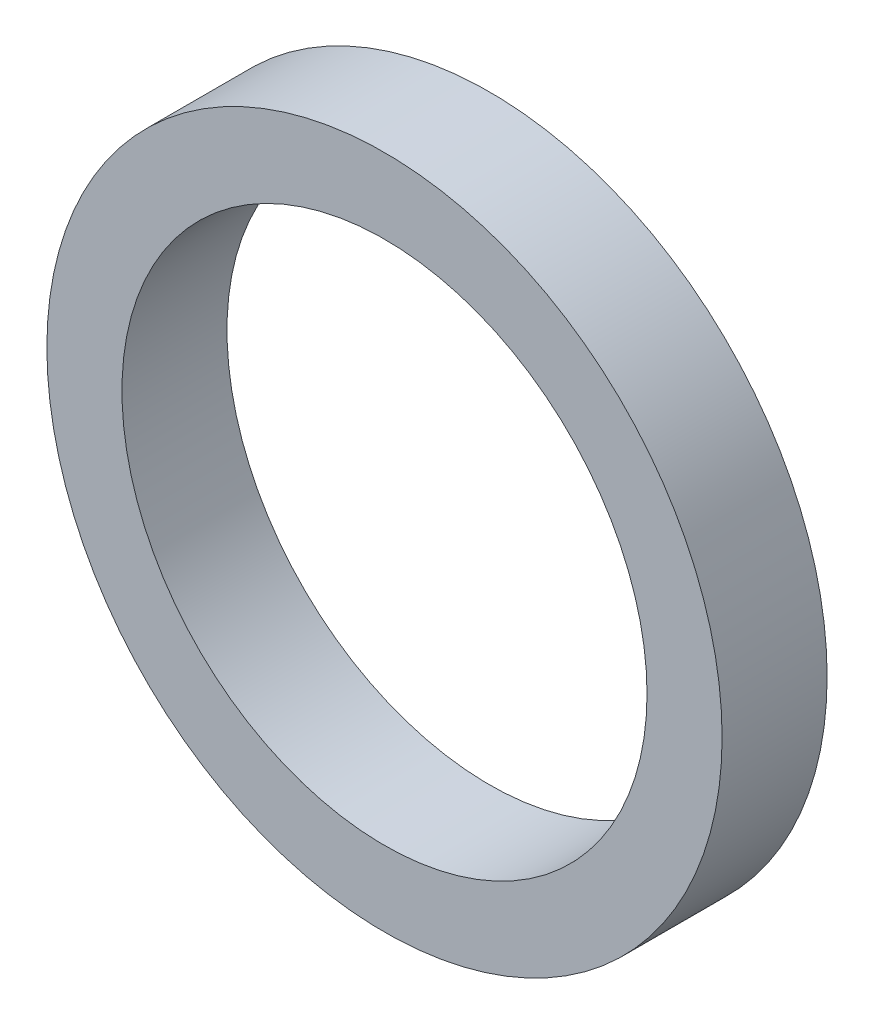
ISO-10303-21;
HEADER;
FILE_DESCRIPTION(('STEP AP214'),'2;1');
FILE_NAME('part.step','',(''),(''),'','','');
FILE_SCHEMA(('AUTOMOTIVE_DESIGN { 1 0 10303 214 1 1 1 1 }'));
ENDSEC;
DATA;
#1=APPLICATION_CONTEXT('core data for automotive mechanical design processes');
#2=APPLICATION_PROTOCOL_DEFINITION('international standard','automotive_design',2000,#1);
#3=PRODUCT_CONTEXT('',#1,'mechanical');
#4=PRODUCT('Part','Part','',(#3));
#5=PRODUCT_RELATED_PRODUCT_CATEGORY('part','',(#4));
#6=PRODUCT_DEFINITION_FORMATION('','',#4);
#7=PRODUCT_DEFINITION_CONTEXT('part definition',#1,'design');
#8=PRODUCT_DEFINITION('design','',#6,#7);
#9=PRODUCT_DEFINITION_SHAPE('','',#8);
#10=(LENGTH_UNIT() NAMED_UNIT(*) SI_UNIT(.MILLI.,.METRE.));
#11=(NAMED_UNIT(*) PLANE_ANGLE_UNIT() SI_UNIT($,.RADIAN.));
#12=(NAMED_UNIT(*) SI_UNIT($,.STERADIAN.) SOLID_ANGLE_UNIT());
#13=UNCERTAINTY_MEASURE_WITH_UNIT(LENGTH_MEASURE(1.E-05),#10,'distance_accuracy_value','');
#14=(GEOMETRIC_REPRESENTATION_CONTEXT(3) GLOBAL_UNCERTAINTY_ASSIGNED_CONTEXT((#13)) GLOBAL_UNIT_ASSIGNED_CONTEXT((#10,
#11,#12)) REPRESENTATION_CONTEXT('',''));
#15=CARTESIAN_POINT('',(0.,0.,0.));
#16=DIRECTION('',(0.,0.,1.));
#17=DIRECTION('',(1.,0.,0.));
#18=AXIS2_PLACEMENT_3D('',#15,#16,#17);
#19=CARTESIAN_POINT('',(0.,0.,1.));
#20=DIRECTION('',(0.,0.,1.));
#21=DIRECTION('',(1.,0.,0.));
#22=AXIS2_PLACEMENT_3D('',#19,#20,#21);
#23=PLANE('',#22);
#24=CARTESIAN_POINT('',(0.,0.,1.));
#25=DIRECTION('',(0.,0.,1.));
#26=DIRECTION('',(1.,0.,0.));
#27=AXIS2_PLACEMENT_3D('',#24,#25,#26);
#28=CIRCLE('',#27,3.215);
#29=CARTESIAN_POINT('',(3.215,0.,1.));
#30=VERTEX_POINT('',#29);
#31=EDGE_CURVE('E10',#30,#30,#28,.T.);
#32=ORIENTED_EDGE('',*,*,#31,.T.);
#33=EDGE_LOOP('',(#32));
#34=FACE_BOUND('',#33,.T.);
#35=CARTESIAN_POINT('',(0.,0.,1.));
#36=DIRECTION('',(0.,0.,1.));
#37=DIRECTION('',(1.,0.,0.));
#38=AXIS2_PLACEMENT_3D('',#35,#36,#37);
#39=CIRCLE('',#38,2.5);
#40=CARTESIAN_POINT('',(2.5,0.,1.));
#41=VERTEX_POINT('',#40);
#42=EDGE_CURVE('E43',#41,#41,#39,.T.);
#43=ORIENTED_EDGE('',*,*,#42,.F.);
#44=EDGE_LOOP('',(#43));
#45=FACE_BOUND('',#44,.T.);
#46=ADVANCED_FACE('F32',(#34,#45),#23,.T.);
#47=CARTESIAN_POINT('',(0.,0.,0.));
#48=DIRECTION('',(0.,0.,1.));
#49=DIRECTION('',(1.,0.,0.));
#50=AXIS2_PLACEMENT_3D('',#47,#48,#49);
#51=PLANE('',#50);
#52=CARTESIAN_POINT('',(0.,0.,0.));
#53=DIRECTION('',(0.,0.,1.));
#54=DIRECTION('',(1.,0.,0.));
#55=AXIS2_PLACEMENT_3D('',#52,#53,#54);
#56=CIRCLE('',#55,3.215);
#57=CARTESIAN_POINT('',(3.215,0.,0.));
#58=VERTEX_POINT('',#57);
#59=EDGE_CURVE('E36',#58,#58,#56,.T.);
#60=ORIENTED_EDGE('',*,*,#59,.F.);
#61=EDGE_LOOP('',(#60));
#62=FACE_BOUND('',#61,.T.);
#63=CARTESIAN_POINT('',(0.,0.,0.));
#64=DIRECTION('',(0.,0.,1.));
#65=DIRECTION('',(1.,0.,0.));
#66=AXIS2_PLACEMENT_3D('',#63,#64,#65);
#67=CIRCLE('',#66,2.5);
#68=CARTESIAN_POINT('',(2.5,0.,0.));
#69=VERTEX_POINT('',#68);
#70=EDGE_CURVE('E45',#69,#69,#67,.T.);
#71=ORIENTED_EDGE('',*,*,#70,.T.);
#72=EDGE_LOOP('',(#71));
#73=FACE_BOUND('',#72,.T.);
#74=ADVANCED_FACE('F55',(#62,#73),#51,.F.);
#75=CARTESIAN_POINT('',(0.,0.,1.));
#76=DIRECTION('',(0.,0.,-1.));
#77=DIRECTION('',(-1.,0.,0.));
#78=AXIS2_PLACEMENT_3D('',#75,#76,#77);
#79=CYLINDRICAL_SURFACE('',#78,3.215);
#80=ORIENTED_EDGE('',*,*,#31,.F.);
#81=EDGE_LOOP('',(#80));
#82=FACE_BOUND('',#81,.T.);
#83=ORIENTED_EDGE('',*,*,#59,.T.);
#84=EDGE_LOOP('',(#83));
#85=FACE_BOUND('',#84,.T.);
#86=ADVANCED_FACE('F34',(#82,#85),#79,.T.);
#87=CARTESIAN_POINT('',(0.,0.,1.));
#88=DIRECTION('',(0.,0.,-1.));
#89=DIRECTION('',(-1.,0.,0.));
#90=AXIS2_PLACEMENT_3D('',#87,#88,#89);
#91=CYLINDRICAL_SURFACE('',#90,2.5);
#92=ORIENTED_EDGE('',*,*,#42,.T.);
#93=EDGE_LOOP('',(#92));
#94=FACE_BOUND('',#93,.T.);
#95=ORIENTED_EDGE('',*,*,#70,.F.);
#96=EDGE_LOOP('',(#95));
#97=FACE_BOUND('',#96,.T.);
#98=ADVANCED_FACE('F51',(#94,#97),#91,.F.);
#99=CLOSED_SHELL('',(#46,#74,#86,#98));
#100=MANIFOLD_SOLID_BREP('B2',#99);
#101=ADVANCED_BREP_SHAPE_REPRESENTATION('',(#18,#100),#14);
#102=SHAPE_DEFINITION_REPRESENTATION(#9,#101);
ENDSEC;
END-ISO-10303-21;
